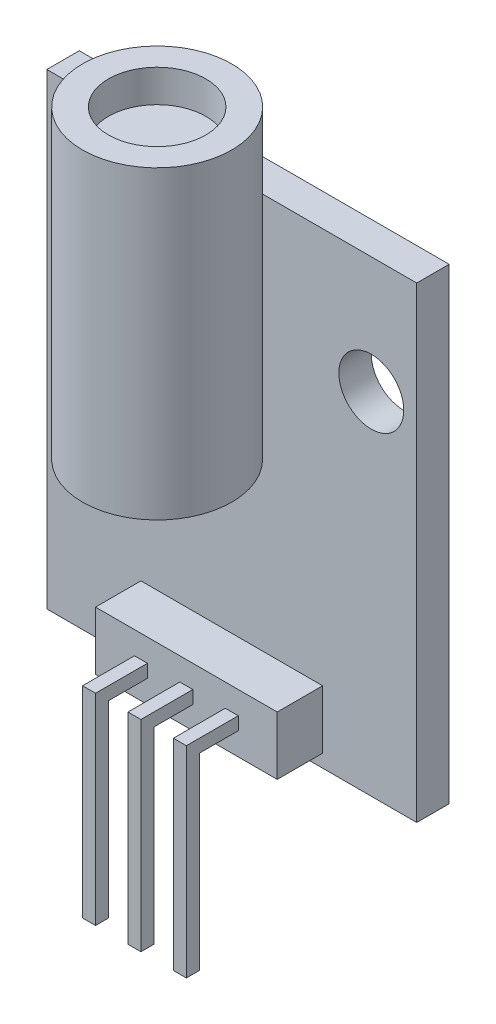
ISO-10303-21;
HEADER;
FILE_DESCRIPTION(('STEP AP214'),'2;1');
FILE_NAME('part.step','',(''),(''),'','','');
FILE_SCHEMA(('AUTOMOTIVE_DESIGN { 1 0 10303 214 1 1 1 1 }'));
ENDSEC;
DATA;
#1=APPLICATION_CONTEXT('core data for automotive mechanical design processes');
#2=APPLICATION_PROTOCOL_DEFINITION('international standard','automotive_design',2000,#1);
#3=PRODUCT_CONTEXT('',#1,'mechanical');
#4=PRODUCT('Part','Part','',(#3));
#5=PRODUCT_RELATED_PRODUCT_CATEGORY('part','',(#4));
#6=PRODUCT_DEFINITION_FORMATION('','',#4);
#7=PRODUCT_DEFINITION_CONTEXT('part definition',#1,'design');
#8=PRODUCT_DEFINITION('design','',#6,#7);
#9=PRODUCT_DEFINITION_SHAPE('','',#8);
#10=(LENGTH_UNIT() NAMED_UNIT(*) SI_UNIT(.MILLI.,.METRE.));
#11=(NAMED_UNIT(*) PLANE_ANGLE_UNIT() SI_UNIT($,.RADIAN.));
#12=(NAMED_UNIT(*) SI_UNIT($,.STERADIAN.) SOLID_ANGLE_UNIT());
#13=UNCERTAINTY_MEASURE_WITH_UNIT(LENGTH_MEASURE(1.E-05),#10,'distance_accuracy_value','');
#14=(GEOMETRIC_REPRESENTATION_CONTEXT(3) GLOBAL_UNCERTAINTY_ASSIGNED_CONTEXT((#13)) GLOBAL_UNIT_ASSIGNED_CONTEXT((#10,
#11,#12)) REPRESENTATION_CONTEXT('',''));
#15=CARTESIAN_POINT('',(0.,0.,0.));
#16=DIRECTION('',(0.,0.,1.));
#17=DIRECTION('',(1.,0.,0.));
#18=AXIS2_PLACEMENT_3D('',#15,#16,#17);
#19=CARTESIAN_POINT('',(0.,1.016,3.556));
#20=DIRECTION('',(0.,1.,0.));
#21=DIRECTION('',(0.,0.,1.));
#22=AXIS2_PLACEMENT_3D('',#19,#20,#21);
#23=CYLINDRICAL_SURFACE('',#22,2.921);
#24=CARTESIAN_POINT('',(0.,1.016,3.556));
#25=DIRECTION('',(0.,1.,0.));
#26=DIRECTION('',(0.,0.,1.));
#27=AXIS2_PLACEMENT_3D('',#24,#25,#26);
#28=CIRCLE('',#27,2.921);
#29=CARTESIAN_POINT('',(0.,1.016,6.477));
#30=VERTEX_POINT('',#29);
#31=EDGE_CURVE('E11',#30,#30,#28,.T.);
#32=ORIENTED_EDGE('',*,*,#31,.T.);
#33=EDGE_LOOP('',(#32));
#34=FACE_BOUND('',#33,.T.);
#35=CARTESIAN_POINT('',(0.,12.954,3.556));
#36=DIRECTION('',(0.,1.,0.));
#37=DIRECTION('',(0.,0.,1.));
#38=AXIS2_PLACEMENT_3D('',#35,#36,#37);
#39=CIRCLE('',#38,2.921);
#40=CARTESIAN_POINT('',(0.,12.954,6.477));
#41=VERTEX_POINT('',#40);
#42=EDGE_CURVE('E63',#41,#41,#39,.T.);
#43=ORIENTED_EDGE('',*,*,#42,.F.);
#44=EDGE_LOOP('',(#43));
#45=FACE_BOUND('',#44,.T.);
#46=ADVANCED_FACE('F57',(#34,#45),#23,.T.);
#47=CARTESIAN_POINT('',(0.,1.016,3.556));
#48=DIRECTION('',(0.,1.,0.));
#49=DIRECTION('',(0.,0.,1.));
#50=AXIS2_PLACEMENT_3D('',#47,#48,#49);
#51=PLANE('',#50);
#52=ORIENTED_EDGE('',*,*,#31,.F.);
#53=EDGE_LOOP('',(#52));
#54=FACE_BOUND('',#53,.T.);
#55=ADVANCED_FACE('F81',(#54),#51,.F.);
#56=CARTESIAN_POINT('',(0.,12.954,3.556));
#57=DIRECTION('',(0.,1.,0.));
#58=DIRECTION('',(0.,0.,1.));
#59=AXIS2_PLACEMENT_3D('',#56,#57,#58);
#60=PLANE('',#59);
#61=CARTESIAN_POINT('',(0.,12.954,3.556));
#62=DIRECTION('',(0.,1.,0.));
#63=DIRECTION('',(0.,0.,1.));
#64=AXIS2_PLACEMENT_3D('',#61,#62,#63);
#65=CIRCLE('',#64,1.905);
#66=CARTESIAN_POINT('',(0.,12.954,5.461));
#67=VERTEX_POINT('',#66);
#68=EDGE_CURVE('E71',#67,#67,#65,.T.);
#69=ORIENTED_EDGE('',*,*,#68,.F.);
#70=EDGE_LOOP('',(#69));
#71=FACE_BOUND('',#70,.T.);
#72=ORIENTED_EDGE('',*,*,#42,.T.);
#73=EDGE_LOOP('',(#72));
#74=FACE_BOUND('',#73,.T.);
#75=ADVANCED_FACE('F79',(#71,#74),#60,.T.);
#76=CARTESIAN_POINT('',(0.,11.684,3.556));
#77=DIRECTION('',(0.,1.,0.));
#78=DIRECTION('',(0.,0.,1.));
#79=AXIS2_PLACEMENT_3D('',#76,#77,#78);
#80=CYLINDRICAL_SURFACE('',#79,1.905);
#81=CARTESIAN_POINT('',(0.,11.684,3.556));
#82=DIRECTION('',(0.,1.,0.));
#83=DIRECTION('',(0.,0.,1.));
#84=AXIS2_PLACEMENT_3D('',#81,#82,#83);
#85=CIRCLE('',#84,1.905);
#86=CARTESIAN_POINT('',(0.,11.684,5.461));
#87=VERTEX_POINT('',#86);
#88=EDGE_CURVE('E67',#87,#87,#85,.T.);
#89=ORIENTED_EDGE('',*,*,#88,.F.);
#90=EDGE_LOOP('',(#89));
#91=FACE_BOUND('',#90,.T.);
#92=ORIENTED_EDGE('',*,*,#68,.T.);
#93=EDGE_LOOP('',(#92));
#94=FACE_BOUND('',#93,.T.);
#95=ADVANCED_FACE('F77',(#91,#94),#80,.F.);
#96=CARTESIAN_POINT('',(0.,11.684,3.556));
#97=DIRECTION('',(0.,1.,0.));
#98=DIRECTION('',(0.,0.,1.));
#99=AXIS2_PLACEMENT_3D('',#96,#97,#98);
#100=PLANE('',#99);
#101=ORIENTED_EDGE('',*,*,#88,.T.);
#102=EDGE_LOOP('',(#101));
#103=FACE_BOUND('',#102,.T.);
#104=ADVANCED_FACE('F88',(#103),#100,.T.);
#105=CLOSED_SHELL('',(#46,#55,#75,#95,#104));
#106=MANIFOLD_SOLID_BREP('B2',#105);
#107=CARTESIAN_POINT('',(1.524,-7.747,4.445));
#108=DIRECTION('',(0.,1.,0.));
#109=DIRECTION('',(0.,0.,1.));
#110=AXIS2_PLACEMENT_3D('',#107,#108,#109);
#111=PLANE('',#110);
#112=DIRECTION('',(1.,0.,0.));
#113=VECTOR('',#112,1.);
#114=CARTESIAN_POINT('',(1.524,-7.747,3.937));
#115=LINE('',#114,#113);
#116=CARTESIAN_POINT('',(1.524,-7.747,3.937));
#117=VERTEX_POINT('',#116);
#118=CARTESIAN_POINT('',(2.032,-7.747,3.937));
#119=VERTEX_POINT('',#118);
#120=EDGE_CURVE('E361',#117,#119,#115,.T.);
#121=ORIENTED_EDGE('',*,*,#120,.F.);
#122=DIRECTION('',(0.,0.,-1.));
#123=VECTOR('',#122,1.);
#124=CARTESIAN_POINT('',(1.524,-7.747,4.445));
#125=LINE('',#124,#123);
#126=CARTESIAN_POINT('',(1.524,-7.747,2.413));
#127=VERTEX_POINT('',#126);
#128=EDGE_CURVE('E447',#117,#127,#125,.T.);
#129=ORIENTED_EDGE('',*,*,#128,.T.);
#130=DIRECTION('',(1.,0.,0.));
#131=VECTOR('',#130,1.);
#132=CARTESIAN_POINT('',(1.524,-7.747,2.413));
#133=LINE('',#132,#131);
#134=CARTESIAN_POINT('',(2.032,-7.747,2.413));
#135=VERTEX_POINT('',#134);
#136=EDGE_CURVE('E452',#127,#135,#133,.T.);
#137=ORIENTED_EDGE('',*,*,#136,.T.);
#138=DIRECTION('',(0.,0.,-1.));
#139=VECTOR('',#138,1.);
#140=CARTESIAN_POINT('',(2.032,-7.747,4.445));
#141=LINE('',#140,#139);
#142=EDGE_CURVE('E449',#119,#135,#141,.T.);
#143=ORIENTED_EDGE('',*,*,#142,.F.);
#144=EDGE_LOOP('',(#121,#129,#137,#143));
#145=FACE_BOUND('',#144,.T.);
#146=ADVANCED_FACE('F152',(#145),#111,.F.);
#147=CARTESIAN_POINT('',(-0.254,-7.747,4.445));
#148=DIRECTION('',(0.,1.,0.));
#149=DIRECTION('',(0.,0.,1.));
#150=AXIS2_PLACEMENT_3D('',#147,#148,#149);
#151=PLANE('',#150);
#152=DIRECTION('',(1.,0.,0.));
#153=VECTOR('',#152,1.);
#154=CARTESIAN_POINT('',(-0.253999999999999,-7.747,3.937));
#155=LINE('',#154,#153);
#156=CARTESIAN_POINT('',(-0.253999999999999,-7.747,3.937));
#157=VERTEX_POINT('',#156);
#158=CARTESIAN_POINT('',(0.254000000000001,-7.747,3.937));
#159=VERTEX_POINT('',#158);
#160=EDGE_CURVE('E365',#157,#159,#155,.T.);
#161=ORIENTED_EDGE('',*,*,#160,.F.);
#162=DIRECTION('',(0.,0.,-1.));
#163=VECTOR('',#162,1.);
#164=CARTESIAN_POINT('',(-0.254,-7.747,4.445));
#165=LINE('',#164,#163);
#166=CARTESIAN_POINT('',(-0.254,-7.747,2.413));
#167=VERTEX_POINT('',#166);
#168=EDGE_CURVE('E175',#157,#167,#165,.T.);
#169=ORIENTED_EDGE('',*,*,#168,.T.);
#170=DIRECTION('',(1.,0.,0.));
#171=VECTOR('',#170,1.);
#172=CARTESIAN_POINT('',(-0.254,-7.747,2.413));
#173=LINE('',#172,#171);
#174=CARTESIAN_POINT('',(0.254,-7.747,2.413));
#175=VERTEX_POINT('',#174);
#176=EDGE_CURVE('E431',#167,#175,#173,.T.);
#177=ORIENTED_EDGE('',*,*,#176,.T.);
#178=DIRECTION('',(0.,0.,-1.));
#179=VECTOR('',#178,1.);
#180=CARTESIAN_POINT('',(0.254,-7.747,4.445));
#181=LINE('',#180,#179);
#182=EDGE_CURVE('E428',#159,#175,#181,.T.);
#183=ORIENTED_EDGE('',*,*,#182,.F.);
#184=EDGE_LOOP('',(#161,#169,#177,#183));
#185=FACE_BOUND('',#184,.T.);
#186=ADVANCED_FACE('F549',(#185),#151,.F.);
#187=CARTESIAN_POINT('',(-2.032,-7.747,4.445));
#188=DIRECTION('',(0.,1.,0.));
#189=DIRECTION('',(0.,0.,1.));
#190=AXIS2_PLACEMENT_3D('',#187,#188,#189);
#191=PLANE('',#190);
#192=DIRECTION('',(1.,0.,0.));
#193=VECTOR('',#192,1.);
#194=CARTESIAN_POINT('',(-2.032,-7.747,3.937));
#195=LINE('',#194,#193);
#196=CARTESIAN_POINT('',(-2.032,-7.747,3.937));
#197=VERTEX_POINT('',#196);
#198=CARTESIAN_POINT('',(-1.524,-7.747,3.937));
#199=VERTEX_POINT('',#198);
#200=EDGE_CURVE('E348',#197,#199,#195,.T.);
#201=ORIENTED_EDGE('',*,*,#200,.F.);
#202=DIRECTION('',(0.,0.,-1.));
#203=VECTOR('',#202,1.);
#204=CARTESIAN_POINT('',(-2.032,-7.747,4.445));
#205=LINE('',#204,#203);
#206=CARTESIAN_POINT('',(-2.032,-7.747,2.413));
#207=VERTEX_POINT('',#206);
#208=EDGE_CURVE('E167',#197,#207,#205,.T.);
#209=ORIENTED_EDGE('',*,*,#208,.T.);
#210=DIRECTION('',(1.,0.,0.));
#211=VECTOR('',#210,1.);
#212=CARTESIAN_POINT('',(-2.032,-7.747,2.413));
#213=LINE('',#212,#211);
#214=CARTESIAN_POINT('',(-1.524,-7.747,2.413));
#215=VERTEX_POINT('',#214);
#216=EDGE_CURVE('E399',#207,#215,#213,.T.);
#217=ORIENTED_EDGE('',*,*,#216,.T.);
#218=DIRECTION('',(0.,0.,-1.));
#219=VECTOR('',#218,1.);
#220=CARTESIAN_POINT('',(-1.524,-7.747,4.445));
#221=LINE('',#220,#219);
#222=EDGE_CURVE('E403',#199,#215,#221,.T.);
#223=ORIENTED_EDGE('',*,*,#222,.F.);
#224=EDGE_LOOP('',(#201,#209,#217,#223));
#225=FACE_BOUND('',#224,.T.);
#226=ADVANCED_FACE('F556',(#225),#191,.F.);
#227=CARTESIAN_POINT('',(0.,0.,2.413));
#228=DIRECTION('',(0.,0.,1.));
#229=DIRECTION('',(1.,0.,0.));
#230=AXIS2_PLACEMENT_3D('',#227,#228,#229);
#231=PLANE('',#230);
#232=DIRECTION('',(0.,1.,0.));
#233=VECTOR('',#232,1.);
#234=CARTESIAN_POINT('',(3.556,-6.35,2.413));
#235=LINE('',#234,#233);
#236=CARTESIAN_POINT('',(3.556,-8.636,2.413));
#237=VERTEX_POINT('',#236);
#238=CARTESIAN_POINT('',(3.556,-6.35,2.413));
#239=VERTEX_POINT('',#238);
#240=EDGE_CURVE('E468',#237,#239,#235,.T.);
#241=ORIENTED_EDGE('',*,*,#240,.T.);
#242=DIRECTION('',(-1.,0.,0.));
#243=VECTOR('',#242,1.);
#244=CARTESIAN_POINT('',(-3.556,-6.35,2.413));
#245=LINE('',#244,#243);
#246=CARTESIAN_POINT('',(-3.556,-6.35,2.413));
#247=VERTEX_POINT('',#246);
#248=EDGE_CURVE('E471',#239,#247,#245,.T.);
#249=ORIENTED_EDGE('',*,*,#248,.T.);
#250=DIRECTION('',(0.,-1.,0.));
#251=VECTOR('',#250,1.);
#252=CARTESIAN_POINT('',(-3.556,-6.35,2.413));
#253=LINE('',#252,#251);
#254=CARTESIAN_POINT('',(-3.556,-8.636,2.413));
#255=VERTEX_POINT('',#254);
#256=EDGE_CURVE('E474',#247,#255,#253,.T.);
#257=ORIENTED_EDGE('',*,*,#256,.T.);
#258=DIRECTION('',(1.,0.,0.));
#259=VECTOR('',#258,1.);
#260=CARTESIAN_POINT('',(-3.556,-8.636,2.413));
#261=LINE('',#260,#259);
#262=EDGE_CURVE('E476',#255,#237,#261,.T.);
#263=ORIENTED_EDGE('',*,*,#262,.T.);
#264=EDGE_LOOP('',(#241,#249,#257,#263));
#265=FACE_BOUND('',#264,.T.);
#266=DIRECTION('',(-1.,0.,0.));
#267=VECTOR('',#266,1.);
#268=CARTESIAN_POINT('',(1.524,-7.239,2.413));
#269=LINE('',#268,#267);
#270=CARTESIAN_POINT('',(2.032,-7.239,2.413));
#271=VERTEX_POINT('',#270);
#272=CARTESIAN_POINT('',(1.524,-7.239,2.413));
#273=VERTEX_POINT('',#272);
#274=EDGE_CURVE('E459',#271,#273,#269,.T.);
#275=ORIENTED_EDGE('',*,*,#274,.F.);
#276=DIRECTION('',(0.,1.,0.));
#277=VECTOR('',#276,1.);
#278=CARTESIAN_POINT('',(2.032,-7.239,2.413));
#279=LINE('',#278,#277);
#280=EDGE_CURVE('E424',#135,#271,#279,.T.);
#281=ORIENTED_EDGE('',*,*,#280,.F.);
#282=ORIENTED_EDGE('',*,*,#136,.F.);
#283=DIRECTION('',(0.,-1.,0.));
#284=VECTOR('',#283,1.);
#285=CARTESIAN_POINT('',(1.524,-7.239,2.413));
#286=LINE('',#285,#284);
#287=EDGE_CURVE('E455',#273,#127,#286,.T.);
#288=ORIENTED_EDGE('',*,*,#287,.F.);
#289=EDGE_LOOP('',(#275,#281,#282,#288));
#290=FACE_BOUND('',#289,.T.);
#291=DIRECTION('',(-1.,0.,0.));
#292=VECTOR('',#291,1.);
#293=CARTESIAN_POINT('',(-0.254,-7.239,2.413));
#294=LINE('',#293,#292);
#295=CARTESIAN_POINT('',(0.254,-7.239,2.413));
#296=VERTEX_POINT('',#295);
#297=CARTESIAN_POINT('',(-0.254,-7.239,2.413));
#298=VERTEX_POINT('',#297);
#299=EDGE_CURVE('E436',#296,#298,#294,.T.);
#300=ORIENTED_EDGE('',*,*,#299,.F.);
#301=DIRECTION('',(0.,1.,0.));
#302=VECTOR('',#301,1.);
#303=CARTESIAN_POINT('',(0.254,-7.239,2.413));
#304=LINE('',#303,#302);
#305=EDGE_CURVE('E408',#175,#296,#304,.T.);
#306=ORIENTED_EDGE('',*,*,#305,.F.);
#307=ORIENTED_EDGE('',*,*,#176,.F.);
#308=DIRECTION('',(0.,-1.,0.));
#309=VECTOR('',#308,1.);
#310=CARTESIAN_POINT('',(-0.254,-7.239,2.413));
#311=LINE('',#310,#309);
#312=EDGE_CURVE('E433',#298,#167,#311,.T.);
#313=ORIENTED_EDGE('',*,*,#312,.F.);
#314=EDGE_LOOP('',(#300,#306,#307,#313));
#315=FACE_BOUND('',#314,.T.);
#316=DIRECTION('',(-1.,0.,0.));
#317=VECTOR('',#316,1.);
#318=CARTESIAN_POINT('',(-2.032,-7.239,2.413));
#319=LINE('',#318,#317);
#320=CARTESIAN_POINT('',(-1.524,-7.239,2.413));
#321=VERTEX_POINT('',#320);
#322=CARTESIAN_POINT('',(-2.032,-7.239,2.413));
#323=VERTEX_POINT('',#322);
#324=EDGE_CURVE('E407',#321,#323,#319,.T.);
#325=ORIENTED_EDGE('',*,*,#324,.F.);
#326=DIRECTION('',(0.,1.,0.));
#327=VECTOR('',#326,1.);
#328=CARTESIAN_POINT('',(-1.524,-7.239,2.413));
#329=LINE('',#328,#327);
#330=EDGE_CURVE('E404',#215,#321,#329,.T.);
#331=ORIENTED_EDGE('',*,*,#330,.F.);
#332=ORIENTED_EDGE('',*,*,#216,.F.);
#333=DIRECTION('',(0.,-1.,0.));
#334=VECTOR('',#333,1.);
#335=CARTESIAN_POINT('',(-2.032,-7.239,2.413));
#336=LINE('',#335,#334);
#337=EDGE_CURVE('E410',#323,#207,#336,.T.);
#338=ORIENTED_EDGE('',*,*,#337,.F.);
#339=EDGE_LOOP('',(#325,#331,#332,#338));
#340=FACE_BOUND('',#339,.T.);
#341=ADVANCED_FACE('F568',(#265,#290,#315,#340),#231,.T.);
#342=CARTESIAN_POINT('',(0.,0.,0.635));
#343=DIRECTION('',(0.,0.,1.));
#344=DIRECTION('',(1.,0.,0.));
#345=AXIS2_PLACEMENT_3D('',#342,#343,#344);
#346=PLANE('',#345);
#347=CARTESIAN_POINT('',(-5.461,4.572,0.635));
#348=DIRECTION('',(0.,0.,1.));
#349=DIRECTION('',(1.,0.,0.));
#350=AXIS2_PLACEMENT_3D('',#347,#348,#349);
#351=CIRCLE('',#350,1.27);
#352=CARTESIAN_POINT('',(-4.191,4.572,0.635));
#353=VERTEX_POINT('',#352);
#354=EDGE_CURVE('E380',#353,#353,#351,.T.);
#355=ORIENTED_EDGE('',*,*,#354,.F.);
#356=EDGE_LOOP('',(#355));
#357=FACE_BOUND('',#356,.T.);
#358=CARTESIAN_POINT('',(5.461,4.572,0.635));
#359=DIRECTION('',(0.,0.,1.));
#360=DIRECTION('',(1.,0.,0.));
#361=AXIS2_PLACEMENT_3D('',#358,#359,#360);
#362=CIRCLE('',#361,1.27);
#363=CARTESIAN_POINT('',(6.731,4.572,0.635));
#364=VERTEX_POINT('',#363);
#365=EDGE_CURVE('E964',#364,#364,#362,.T.);
#366=ORIENTED_EDGE('',*,*,#365,.F.);
#367=EDGE_LOOP('',(#366));
#368=FACE_BOUND('',#367,.T.);
#369=DIRECTION('',(0.,1.,0.));
#370=VECTOR('',#369,1.);
#371=CARTESIAN_POINT('',(7.239,9.144,0.635));
#372=LINE('',#371,#370);
#373=CARTESIAN_POINT('',(7.239,-9.144,0.635));
#374=VERTEX_POINT('',#373);
#375=CARTESIAN_POINT('',(7.239,9.144,0.635));
#376=VERTEX_POINT('',#375);
#377=EDGE_CURVE('E497',#374,#376,#372,.T.);
#378=ORIENTED_EDGE('',*,*,#377,.T.);
#379=DIRECTION('',(-1.,0.,0.));
#380=VECTOR('',#379,1.);
#381=CARTESIAN_POINT('',(-7.239,9.144,0.635));
#382=LINE('',#381,#380);
#383=CARTESIAN_POINT('',(-7.239,9.144,0.635));
#384=VERTEX_POINT('',#383);
#385=EDGE_CURVE('E500',#376,#384,#382,.T.);
#386=ORIENTED_EDGE('',*,*,#385,.T.);
#387=DIRECTION('',(0.,-1.,0.));
#388=VECTOR('',#387,1.);
#389=CARTESIAN_POINT('',(-7.239,9.144,0.635));
#390=LINE('',#389,#388);
#391=CARTESIAN_POINT('',(-7.239,-9.144,0.635));
#392=VERTEX_POINT('',#391);
#393=EDGE_CURVE('E503',#384,#392,#390,.T.);
#394=ORIENTED_EDGE('',*,*,#393,.T.);
#395=DIRECTION('',(1.,0.,0.));
#396=VECTOR('',#395,1.);
#397=CARTESIAN_POINT('',(-7.239,-9.144,0.635));
#398=LINE('',#397,#396);
#399=EDGE_CURVE('E505',#392,#374,#398,.T.);
#400=ORIENTED_EDGE('',*,*,#399,.T.);
#401=EDGE_LOOP('',(#378,#386,#394,#400));
#402=FACE_BOUND('',#401,.T.);
#403=DIRECTION('',(-1.,0.,0.));
#404=VECTOR('',#403,1.);
#405=CARTESIAN_POINT('',(-3.556,-6.35,0.635));
#406=LINE('',#405,#404);
#407=CARTESIAN_POINT('',(3.556,-6.35,0.635));
#408=VERTEX_POINT('',#407);
#409=CARTESIAN_POINT('',(-3.556,-6.35,0.635));
#410=VERTEX_POINT('',#409);
#411=EDGE_CURVE('E481',#408,#410,#406,.T.);
#412=ORIENTED_EDGE('',*,*,#411,.F.);
#413=DIRECTION('',(0.,1.,0.));
#414=VECTOR('',#413,1.);
#415=CARTESIAN_POINT('',(3.556,-6.35,0.635));
#416=LINE('',#415,#414);
#417=CARTESIAN_POINT('',(3.556,-8.636,0.635));
#418=VERTEX_POINT('',#417);
#419=EDGE_CURVE('E420',#418,#408,#416,.T.);
#420=ORIENTED_EDGE('',*,*,#419,.F.);
#421=DIRECTION('',(1.,0.,0.));
#422=VECTOR('',#421,1.);
#423=CARTESIAN_POINT('',(-3.556,-8.636,0.635));
#424=LINE('',#423,#422);
#425=CARTESIAN_POINT('',(-3.556,-8.636,0.635));
#426=VERTEX_POINT('',#425);
#427=EDGE_CURVE('E472',#426,#418,#424,.T.);
#428=ORIENTED_EDGE('',*,*,#427,.F.);
#429=DIRECTION('',(0.,-1.,0.));
#430=VECTOR('',#429,1.);
#431=CARTESIAN_POINT('',(-3.556,-6.35,0.635));
#432=LINE('',#431,#430);
#433=EDGE_CURVE('E483',#410,#426,#432,.T.);
#434=ORIENTED_EDGE('',*,*,#433,.F.);
#435=EDGE_LOOP('',(#412,#420,#428,#434));
#436=FACE_BOUND('',#435,.T.);
#437=ADVANCED_FACE('F539',(#357,#368,#402,#436),#346,.T.);
#438=CARTESIAN_POINT('',(7.239,9.144,0.635));
#439=DIRECTION('',(-1.,0.,0.));
#440=DIRECTION('',(0.,-1.,0.));
#441=AXIS2_PLACEMENT_3D('',#438,#439,#440);
#442=PLANE('',#441);
#443=DIRECTION('',(0.,1.,0.));
#444=VECTOR('',#443,1.);
#445=CARTESIAN_POINT('',(7.239,9.144,-0.635));
#446=LINE('',#445,#444);
#447=CARTESIAN_POINT('',(7.239,-9.144,-0.635));
#448=VERTEX_POINT('',#447);
#449=CARTESIAN_POINT('',(7.239,9.144,-0.635));
#450=VERTEX_POINT('',#449);
#451=EDGE_CURVE('E496',#448,#450,#446,.T.);
#452=ORIENTED_EDGE('',*,*,#451,.T.);
#453=DIRECTION('',(0.,0.,-1.));
#454=VECTOR('',#453,1.);
#455=CARTESIAN_POINT('',(7.239,9.144,0.635));
#456=LINE('',#455,#454);
#457=EDGE_CURVE('E55',#376,#450,#456,.T.);
#458=ORIENTED_EDGE('',*,*,#457,.F.);
#459=ORIENTED_EDGE('',*,*,#377,.F.);
#460=DIRECTION('',(0.,0.,-1.));
#461=VECTOR('',#460,1.);
#462=CARTESIAN_POINT('',(7.239,-9.144,0.635));
#463=LINE('',#462,#461);
#464=EDGE_CURVE('E507',#374,#448,#463,.T.);
#465=ORIENTED_EDGE('',*,*,#464,.T.);
#466=EDGE_LOOP('',(#452,#458,#459,#465));
#467=FACE_BOUND('',#466,.T.);
#468=ADVANCED_FACE('F154',(#467),#442,.F.);
#469=CARTESIAN_POINT('',(-7.239,9.144,0.635));
#470=DIRECTION('',(0.,-1.,0.));
#471=DIRECTION('',(0.,0.,-1.));
#472=AXIS2_PLACEMENT_3D('',#469,#470,#471);
#473=PLANE('',#472);
#474=DIRECTION('',(-1.,0.,0.));
#475=VECTOR('',#474,1.);
#476=CARTESIAN_POINT('',(-7.239,9.144,-0.635));
#477=LINE('',#476,#475);
#478=CARTESIAN_POINT('',(-7.239,9.144,-0.635));
#479=VERTEX_POINT('',#478);
#480=EDGE_CURVE('E510',#450,#479,#477,.T.);
#481=ORIENTED_EDGE('',*,*,#480,.T.);
#482=DIRECTION('',(0.,0.,-1.));
#483=VECTOR('',#482,1.);
#484=CARTESIAN_POINT('',(-7.239,9.144,0.635));
#485=LINE('',#484,#483);
#486=EDGE_CURVE('E160',#384,#479,#485,.T.);
#487=ORIENTED_EDGE('',*,*,#486,.F.);
#488=ORIENTED_EDGE('',*,*,#385,.F.);
#489=ORIENTED_EDGE('',*,*,#457,.T.);
#490=EDGE_LOOP('',(#481,#487,#488,#489));
#491=FACE_BOUND('',#490,.T.);
#492=ADVANCED_FACE('F541',(#491),#473,.F.);
#493=CARTESIAN_POINT('',(-7.239,9.144,0.635));
#494=DIRECTION('',(1.,0.,0.));
#495=DIRECTION('',(0.,1.,0.));
#496=AXIS2_PLACEMENT_3D('',#493,#494,#495);
#497=PLANE('',#496);
#498=DIRECTION('',(0.,-1.,0.));
#499=VECTOR('',#498,1.);
#500=CARTESIAN_POINT('',(-7.239,9.144,-0.635));
#501=LINE('',#500,#499);
#502=CARTESIAN_POINT('',(-7.239,-9.144,-0.635));
#503=VERTEX_POINT('',#502);
#504=EDGE_CURVE('E512',#479,#503,#501,.T.);
#505=ORIENTED_EDGE('',*,*,#504,.T.);
#506=DIRECTION('',(0.,0.,-1.));
#507=VECTOR('',#506,1.);
#508=CARTESIAN_POINT('',(-7.239,-9.144,0.635));
#509=LINE('',#508,#507);
#510=EDGE_CURVE('E517',#392,#503,#509,.T.);
#511=ORIENTED_EDGE('',*,*,#510,.F.);
#512=ORIENTED_EDGE('',*,*,#393,.F.);
#513=ORIENTED_EDGE('',*,*,#486,.T.);
#514=EDGE_LOOP('',(#505,#511,#512,#513));
#515=FACE_BOUND('',#514,.T.);
#516=ADVANCED_FACE('F524',(#515),#497,.F.);
#517=CARTESIAN_POINT('',(-7.239,-9.144,0.635));
#518=DIRECTION('',(0.,1.,0.));
#519=DIRECTION('',(0.,0.,1.));
#520=AXIS2_PLACEMENT_3D('',#517,#518,#519);
#521=PLANE('',#520);
#522=DIRECTION('',(1.,0.,0.));
#523=VECTOR('',#522,1.);
#524=CARTESIAN_POINT('',(-7.239,-9.144,-0.635));
#525=LINE('',#524,#523);
#526=EDGE_CURVE('E501',#503,#448,#525,.T.);
#527=ORIENTED_EDGE('',*,*,#526,.T.);
#528=ORIENTED_EDGE('',*,*,#464,.F.);
#529=ORIENTED_EDGE('',*,*,#399,.F.);
#530=ORIENTED_EDGE('',*,*,#510,.T.);
#531=EDGE_LOOP('',(#527,#528,#529,#530));
#532=FACE_BOUND('',#531,.T.);
#533=ADVANCED_FACE('F533',(#532),#521,.F.);
#534=CARTESIAN_POINT('',(0.,0.,-0.635));
#535=DIRECTION('',(0.,0.,1.));
#536=DIRECTION('',(1.,0.,0.));
#537=AXIS2_PLACEMENT_3D('',#534,#535,#536);
#538=PLANE('',#537);
#539=CARTESIAN_POINT('',(-5.461,4.572,-0.635));
#540=DIRECTION('',(0.,0.,1.));
#541=DIRECTION('',(1.,0.,0.));
#542=AXIS2_PLACEMENT_3D('',#539,#540,#541);
#543=CIRCLE('',#542,1.27);
#544=CARTESIAN_POINT('',(-4.191,4.572,-0.635));
#545=VERTEX_POINT('',#544);
#546=EDGE_CURVE('E967',#545,#545,#543,.T.);
#547=ORIENTED_EDGE('',*,*,#546,.T.);
#548=EDGE_LOOP('',(#547));
#549=FACE_BOUND('',#548,.T.);
#550=CARTESIAN_POINT('',(5.461,4.572,-0.635));
#551=DIRECTION('',(0.,0.,1.));
#552=DIRECTION('',(1.,0.,0.));
#553=AXIS2_PLACEMENT_3D('',#550,#551,#552);
#554=CIRCLE('',#553,1.27);
#555=CARTESIAN_POINT('',(6.731,4.572,-0.635));
#556=VERTEX_POINT('',#555);
#557=EDGE_CURVE('E968',#556,#556,#554,.T.);
#558=ORIENTED_EDGE('',*,*,#557,.T.);
#559=EDGE_LOOP('',(#558));
#560=FACE_BOUND('',#559,.T.);
#561=ORIENTED_EDGE('',*,*,#451,.F.);
#562=ORIENTED_EDGE('',*,*,#526,.F.);
#563=ORIENTED_EDGE('',*,*,#504,.F.);
#564=ORIENTED_EDGE('',*,*,#480,.F.);
#565=EDGE_LOOP('',(#561,#562,#563,#564));
#566=FACE_BOUND('',#565,.T.);
#567=ADVANCED_FACE('F530',(#549,#560,#566),#538,.F.);
#568=CARTESIAN_POINT('',(3.556,-6.35,2.413));
#569=DIRECTION('',(-1.,0.,0.));
#570=DIRECTION('',(0.,-1.,0.));
#571=AXIS2_PLACEMENT_3D('',#568,#569,#570);
#572=PLANE('',#571);
#573=ORIENTED_EDGE('',*,*,#419,.T.);
#574=DIRECTION('',(0.,0.,-1.));
#575=VECTOR('',#574,1.);
#576=CARTESIAN_POINT('',(3.556,-6.35,2.413));
#577=LINE('',#576,#575);
#578=EDGE_CURVE('E494',#239,#408,#577,.T.);
#579=ORIENTED_EDGE('',*,*,#578,.F.);
#580=ORIENTED_EDGE('',*,*,#240,.F.);
#581=DIRECTION('',(0.,0.,-1.));
#582=VECTOR('',#581,1.);
#583=CARTESIAN_POINT('',(3.556,-8.636,2.413));
#584=LINE('',#583,#582);
#585=EDGE_CURVE('E478',#237,#418,#584,.T.);
#586=ORIENTED_EDGE('',*,*,#585,.T.);
#587=EDGE_LOOP('',(#573,#579,#580,#586));
#588=FACE_BOUND('',#587,.T.);
#589=ADVANCED_FACE('F584',(#588),#572,.F.);
#590=CARTESIAN_POINT('',(-3.556,-6.35,2.413));
#591=DIRECTION('',(0.,-1.,0.));
#592=DIRECTION('',(0.,0.,-1.));
#593=AXIS2_PLACEMENT_3D('',#590,#591,#592);
#594=PLANE('',#593);
#595=ORIENTED_EDGE('',*,*,#411,.T.);
#596=DIRECTION('',(0.,0.,-1.));
#597=VECTOR('',#596,1.);
#598=CARTESIAN_POINT('',(-3.556,-6.35,2.413));
#599=LINE('',#598,#597);
#600=EDGE_CURVE('E491',#247,#410,#599,.T.);
#601=ORIENTED_EDGE('',*,*,#600,.F.);
#602=ORIENTED_EDGE('',*,*,#248,.F.);
#603=ORIENTED_EDGE('',*,*,#578,.T.);
#604=EDGE_LOOP('',(#595,#601,#602,#603));
#605=FACE_BOUND('',#604,.T.);
#606=ADVANCED_FACE('F580',(#605),#594,.F.);
#607=CARTESIAN_POINT('',(-3.556,-6.35,2.413));
#608=DIRECTION('',(1.,0.,0.));
#609=DIRECTION('',(0.,1.,0.));
#610=AXIS2_PLACEMENT_3D('',#607,#608,#609);
#611=PLANE('',#610);
#612=ORIENTED_EDGE('',*,*,#433,.T.);
#613=DIRECTION('',(0.,0.,-1.));
#614=VECTOR('',#613,1.);
#615=CARTESIAN_POINT('',(-3.556,-8.636,2.413));
#616=LINE('',#615,#614);
#617=EDGE_CURVE('E489',#255,#426,#616,.T.);
#618=ORIENTED_EDGE('',*,*,#617,.F.);
#619=ORIENTED_EDGE('',*,*,#256,.F.);
#620=ORIENTED_EDGE('',*,*,#600,.T.);
#621=EDGE_LOOP('',(#612,#618,#619,#620));
#622=FACE_BOUND('',#621,.T.);
#623=ADVANCED_FACE('F576',(#622),#611,.F.);
#624=CARTESIAN_POINT('',(-3.556,-8.636,2.413));
#625=DIRECTION('',(0.,1.,0.));
#626=DIRECTION('',(0.,0.,1.));
#627=AXIS2_PLACEMENT_3D('',#624,#625,#626);
#628=PLANE('',#627);
#629=ORIENTED_EDGE('',*,*,#427,.T.);
#630=ORIENTED_EDGE('',*,*,#585,.F.);
#631=ORIENTED_EDGE('',*,*,#262,.F.);
#632=ORIENTED_EDGE('',*,*,#617,.T.);
#633=EDGE_LOOP('',(#629,#630,#631,#632));
#634=FACE_BOUND('',#633,.T.);
#635=ADVANCED_FACE('F572',(#634),#628,.F.);
#636=CARTESIAN_POINT('',(2.032,-7.239,4.445));
#637=DIRECTION('',(-1.,0.,0.));
#638=DIRECTION('',(0.,0.,1.));
#639=AXIS2_PLACEMENT_3D('',#636,#637,#638);
#640=PLANE('',#639);
#641=ORIENTED_EDGE('',*,*,#280,.T.);
#642=DIRECTION('',(0.,0.,-1.));
#643=VECTOR('',#642,1.);
#644=CARTESIAN_POINT('',(2.032,-7.239,4.445));
#645=LINE('',#644,#643);
#646=CARTESIAN_POINT('',(2.032,-7.239,4.445));
#647=VERTEX_POINT('',#646);
#648=EDGE_CURVE('E351',#647,#271,#645,.T.);
#649=ORIENTED_EDGE('',*,*,#648,.F.);
#650=DIRECTION('',(0.,1.,0.));
#651=VECTOR('',#650,1.);
#652=CARTESIAN_POINT('',(2.032,-7.239,4.445));
#653=LINE('',#652,#651);
#654=CARTESIAN_POINT('',(2.032,-15.113,4.445));
#655=VERTEX_POINT('',#654);
#656=EDGE_CURVE('E456',#655,#647,#653,.T.);
#657=ORIENTED_EDGE('',*,*,#656,.F.);
#658=DIRECTION('',(0.,0.,1.));
#659=VECTOR('',#658,1.);
#660=CARTESIAN_POINT('',(2.032,-15.113,4.445));
#661=LINE('',#660,#659);
#662=CARTESIAN_POINT('',(2.032,-15.113,3.937));
#663=VERTEX_POINT('',#662);
#664=EDGE_CURVE('E388',#663,#655,#661,.T.);
#665=ORIENTED_EDGE('',*,*,#664,.F.);
#666=DIRECTION('',(0.,1.,0.));
#667=VECTOR('',#666,1.);
#668=CARTESIAN_POINT('',(2.032,-15.113,3.937));
#669=LINE('',#668,#667);
#670=EDGE_CURVE('E379',#663,#119,#669,.T.);
#671=ORIENTED_EDGE('',*,*,#670,.T.);
#672=ORIENTED_EDGE('',*,*,#142,.T.);
#673=EDGE_LOOP('',(#641,#649,#657,#665,#671,#672));
#674=FACE_BOUND('',#673,.T.);
#675=ADVANCED_FACE('F575',(#674),#640,.F.);
#676=CARTESIAN_POINT('',(1.524,-7.239,4.445));
#677=DIRECTION('',(0.,-1.,0.));
#678=DIRECTION('',(0.,0.,-1.));
#679=AXIS2_PLACEMENT_3D('',#676,#677,#678);
#680=PLANE('',#679);
#681=ORIENTED_EDGE('',*,*,#274,.T.);
#682=DIRECTION('',(0.,0.,-1.));
#683=VECTOR('',#682,1.);
#684=CARTESIAN_POINT('',(1.524,-7.239,4.445));
#685=LINE('',#684,#683);
#686=CARTESIAN_POINT('',(1.524,-7.239,4.445));
#687=VERTEX_POINT('',#686);
#688=EDGE_CURVE('E353',#687,#273,#685,.T.);
#689=ORIENTED_EDGE('',*,*,#688,.F.);
#690=DIRECTION('',(-1.,0.,0.));
#691=VECTOR('',#690,1.);
#692=CARTESIAN_POINT('',(1.524,-7.239,4.445));
#693=LINE('',#692,#691);
#694=EDGE_CURVE('E464',#647,#687,#693,.T.);
#695=ORIENTED_EDGE('',*,*,#694,.F.);
#696=ORIENTED_EDGE('',*,*,#648,.T.);
#697=EDGE_LOOP('',(#681,#689,#695,#696));
#698=FACE_BOUND('',#697,.T.);
#699=ADVANCED_FACE('F818',(#698),#680,.F.);
#700=CARTESIAN_POINT('',(1.524,-7.239,4.445));
#701=DIRECTION('',(1.,0.,0.));
#702=DIRECTION('',(0.,0.,-1.));
#703=AXIS2_PLACEMENT_3D('',#700,#701,#702);
#704=PLANE('',#703);
#705=ORIENTED_EDGE('',*,*,#287,.T.);
#706=ORIENTED_EDGE('',*,*,#128,.F.);
#707=DIRECTION('',(0.,1.,0.));
#708=VECTOR('',#707,1.);
#709=CARTESIAN_POINT('',(1.524,-15.113,3.937));
#710=LINE('',#709,#708);
#711=CARTESIAN_POINT('',(1.524,-15.113,3.937));
#712=VERTEX_POINT('',#711);
#713=EDGE_CURVE('E377',#712,#117,#710,.T.);
#714=ORIENTED_EDGE('',*,*,#713,.F.);
#715=DIRECTION('',(0.,0.,-1.));
#716=VECTOR('',#715,1.);
#717=CARTESIAN_POINT('',(1.524,-15.113,4.445));
#718=LINE('',#717,#716);
#719=CARTESIAN_POINT('',(1.524,-15.113,4.445));
#720=VERTEX_POINT('',#719);
#721=EDGE_CURVE('E385',#720,#712,#718,.T.);
#722=ORIENTED_EDGE('',*,*,#721,.F.);
#723=DIRECTION('',(0.,-1.,0.));
#724=VECTOR('',#723,1.);
#725=CARTESIAN_POINT('',(1.524,-7.239,4.445));
#726=LINE('',#725,#724);
#727=EDGE_CURVE('E451',#687,#720,#726,.T.);
#728=ORIENTED_EDGE('',*,*,#727,.F.);
#729=ORIENTED_EDGE('',*,*,#688,.T.);
#730=EDGE_LOOP('',(#705,#706,#714,#722,#728,#729));
#731=FACE_BOUND('',#730,.T.);
#732=ADVANCED_FACE('F561',(#731),#704,.F.);
#733=CARTESIAN_POINT('',(0.,0.,4.445));
#734=DIRECTION('',(0.,0.,1.));
#735=DIRECTION('',(1.,0.,0.));
#736=AXIS2_PLACEMENT_3D('',#733,#734,#735);
#737=PLANE('',#736);
#738=ORIENTED_EDGE('',*,*,#656,.T.);
#739=ORIENTED_EDGE('',*,*,#694,.T.);
#740=ORIENTED_EDGE('',*,*,#727,.T.);
#741=DIRECTION('',(-1.,0.,0.));
#742=VECTOR('',#741,1.);
#743=CARTESIAN_POINT('',(1.524,-15.113,4.445));
#744=LINE('',#743,#742);
#745=EDGE_CURVE('E383',#655,#720,#744,.T.);
#746=ORIENTED_EDGE('',*,*,#745,.F.);
#747=EDGE_LOOP('',(#738,#739,#740,#746));
#748=FACE_BOUND('',#747,.T.);
#749=ADVANCED_FACE('F563',(#748),#737,.T.);
#750=CARTESIAN_POINT('',(0.254,-7.239,4.445));
#751=DIRECTION('',(-1.,0.,0.));
#752=DIRECTION('',(0.,-1.,0.));
#753=AXIS2_PLACEMENT_3D('',#750,#751,#752);
#754=PLANE('',#753);
#755=ORIENTED_EDGE('',*,*,#305,.T.);
#756=DIRECTION('',(0.,0.,-1.));
#757=VECTOR('',#756,1.);
#758=CARTESIAN_POINT('',(0.254,-7.239,4.445));
#759=LINE('',#758,#757);
#760=CARTESIAN_POINT('',(0.254,-7.239,4.445));
#761=VERTEX_POINT('',#760);
#762=EDGE_CURVE('E421',#761,#296,#759,.T.);
#763=ORIENTED_EDGE('',*,*,#762,.F.);
#764=DIRECTION('',(0.,1.,0.));
#765=VECTOR('',#764,1.);
#766=CARTESIAN_POINT('',(0.254,-7.239,4.445));
#767=LINE('',#766,#765);
#768=CARTESIAN_POINT('',(0.254000000000001,-15.113,4.445));
#769=VERTEX_POINT('',#768);
#770=EDGE_CURVE('E434',#769,#761,#767,.T.);
#771=ORIENTED_EDGE('',*,*,#770,.F.);
#772=DIRECTION('',(0.,0.,1.));
#773=VECTOR('',#772,1.);
#774=CARTESIAN_POINT('',(0.254000000000001,-15.113,3.937));
#775=LINE('',#774,#773);
#776=CARTESIAN_POINT('',(0.254000000000001,-15.113,3.937));
#777=VERTEX_POINT('',#776);
#778=EDGE_CURVE('E370',#777,#769,#775,.T.);
#779=ORIENTED_EDGE('',*,*,#778,.F.);
#780=DIRECTION('',(0.,1.,0.));
#781=VECTOR('',#780,1.);
#782=CARTESIAN_POINT('',(0.254000000000001,-15.113,3.937));
#783=LINE('',#782,#781);
#784=EDGE_CURVE('E360',#777,#159,#783,.T.);
#785=ORIENTED_EDGE('',*,*,#784,.T.);
#786=ORIENTED_EDGE('',*,*,#182,.T.);
#787=EDGE_LOOP('',(#755,#763,#771,#779,#785,#786));
#788=FACE_BOUND('',#787,.T.);
#789=ADVANCED_FACE('F566',(#788),#754,.F.);
#790=CARTESIAN_POINT('',(-0.254,-7.239,4.445));
#791=DIRECTION('',(0.,-1.,0.));
#792=DIRECTION('',(0.,0.,-1.));
#793=AXIS2_PLACEMENT_3D('',#790,#791,#792);
#794=PLANE('',#793);
#795=ORIENTED_EDGE('',*,*,#299,.T.);
#796=DIRECTION('',(0.,0.,-1.));
#797=VECTOR('',#796,1.);
#798=CARTESIAN_POINT('',(-0.254,-7.239,4.445));
#799=LINE('',#798,#797);
#800=CARTESIAN_POINT('',(-0.254,-7.239,4.445));
#801=VERTEX_POINT('',#800);
#802=EDGE_CURVE('E423',#801,#298,#799,.T.);
#803=ORIENTED_EDGE('',*,*,#802,.F.);
#804=DIRECTION('',(-1.,0.,0.));
#805=VECTOR('',#804,1.);
#806=CARTESIAN_POINT('',(-0.254,-7.239,4.445));
#807=LINE('',#806,#805);
#808=EDGE_CURVE('E441',#761,#801,#807,.T.);
#809=ORIENTED_EDGE('',*,*,#808,.F.);
#810=ORIENTED_EDGE('',*,*,#762,.T.);
#811=EDGE_LOOP('',(#795,#803,#809,#810));
#812=FACE_BOUND('',#811,.T.);
#813=ADVANCED_FACE('F786',(#812),#794,.F.);
#814=CARTESIAN_POINT('',(-0.254,-7.239,4.445));
#815=DIRECTION('',(1.,0.,0.));
#816=DIRECTION('',(0.,1.,0.));
#817=AXIS2_PLACEMENT_3D('',#814,#815,#816);
#818=PLANE('',#817);
#819=ORIENTED_EDGE('',*,*,#312,.T.);
#820=ORIENTED_EDGE('',*,*,#168,.F.);
#821=DIRECTION('',(0.,1.,0.));
#822=VECTOR('',#821,1.);
#823=CARTESIAN_POINT('',(-0.253999999999999,-15.113,3.937));
#824=LINE('',#823,#822);
#825=CARTESIAN_POINT('',(-0.253999999999999,-15.113,3.937));
#826=VERTEX_POINT('',#825);
#827=EDGE_CURVE('E358',#826,#157,#824,.T.);
#828=ORIENTED_EDGE('',*,*,#827,.F.);
#829=DIRECTION('',(0.,0.,-1.));
#830=VECTOR('',#829,1.);
#831=CARTESIAN_POINT('',(-0.253999999999999,-15.113,3.937));
#832=LINE('',#831,#830);
#833=CARTESIAN_POINT('',(-0.253999999999999,-15.113,4.445));
#834=VERTEX_POINT('',#833);
#835=EDGE_CURVE('E367',#834,#826,#832,.T.);
#836=ORIENTED_EDGE('',*,*,#835,.F.);
#837=DIRECTION('',(0.,-1.,0.));
#838=VECTOR('',#837,1.);
#839=CARTESIAN_POINT('',(-0.254,-7.239,4.445));
#840=LINE('',#839,#838);
#841=EDGE_CURVE('E430',#801,#834,#840,.T.);
#842=ORIENTED_EDGE('',*,*,#841,.F.);
#843=ORIENTED_EDGE('',*,*,#802,.T.);
#844=EDGE_LOOP('',(#819,#820,#828,#836,#842,#843));
#845=FACE_BOUND('',#844,.T.);
#846=ADVANCED_FACE('F774',(#845),#818,.F.);
#847=CARTESIAN_POINT('',(0.,0.,4.445));
#848=DIRECTION('',(0.,0.,1.));
#849=DIRECTION('',(1.,0.,0.));
#850=AXIS2_PLACEMENT_3D('',#847,#848,#849);
#851=PLANE('',#850);
#852=ORIENTED_EDGE('',*,*,#770,.T.);
#853=ORIENTED_EDGE('',*,*,#808,.T.);
#854=ORIENTED_EDGE('',*,*,#841,.T.);
#855=DIRECTION('',(-1.,0.,0.));
#856=VECTOR('',#855,1.);
#857=CARTESIAN_POINT('',(-0.253999999999999,-15.113,4.445));
#858=LINE('',#857,#856);
#859=EDGE_CURVE('E364',#769,#834,#858,.T.);
#860=ORIENTED_EDGE('',*,*,#859,.F.);
#861=EDGE_LOOP('',(#852,#853,#854,#860));
#862=FACE_BOUND('',#861,.T.);
#863=ADVANCED_FACE('F762',(#862),#851,.T.);
#864=CARTESIAN_POINT('',(-1.524,-7.239,4.445));
#865=DIRECTION('',(-1.,0.,0.));
#866=DIRECTION('',(0.,0.,1.));
#867=AXIS2_PLACEMENT_3D('',#864,#865,#866);
#868=PLANE('',#867);
#869=ORIENTED_EDGE('',*,*,#330,.T.);
#870=DIRECTION('',(0.,0.,-1.));
#871=VECTOR('',#870,1.);
#872=CARTESIAN_POINT('',(-1.524,-7.239,4.445));
#873=LINE('',#872,#871);
#874=CARTESIAN_POINT('',(-1.524,-7.239,4.445));
#875=VERTEX_POINT('',#874);
#876=EDGE_CURVE('E418',#875,#321,#873,.T.);
#877=ORIENTED_EDGE('',*,*,#876,.F.);
#878=DIRECTION('',(0.,1.,0.));
#879=VECTOR('',#878,1.);
#880=CARTESIAN_POINT('',(-1.524,-7.239,4.445));
#881=LINE('',#880,#879);
#882=CARTESIAN_POINT('',(-1.524,-15.113,4.445));
#883=VERTEX_POINT('',#882);
#884=EDGE_CURVE('E395',#883,#875,#881,.T.);
#885=ORIENTED_EDGE('',*,*,#884,.F.);
#886=DIRECTION('',(0.,0.,1.));
#887=VECTOR('',#886,1.);
#888=CARTESIAN_POINT('',(-1.524,-15.113,4.445));
#889=LINE('',#888,#887);
#890=CARTESIAN_POINT('',(-1.524,-15.113,3.937));
#891=VERTEX_POINT('',#890);
#892=EDGE_CURVE('E338',#891,#883,#889,.T.);
#893=ORIENTED_EDGE('',*,*,#892,.F.);
#894=DIRECTION('',(0.,1.,0.));
#895=VECTOR('',#894,1.);
#896=CARTESIAN_POINT('',(-1.524,-15.113,3.937));
#897=LINE('',#896,#895);
#898=EDGE_CURVE('E334',#891,#199,#897,.T.);
#899=ORIENTED_EDGE('',*,*,#898,.T.);
#900=ORIENTED_EDGE('',*,*,#222,.T.);
#901=EDGE_LOOP('',(#869,#877,#885,#893,#899,#900));
#902=FACE_BOUND('',#901,.T.);
#903=ADVANCED_FACE('F757',(#902),#868,.F.);
#904=CARTESIAN_POINT('',(-2.032,-7.239,4.445));
#905=DIRECTION('',(0.,-1.,0.));
#906=DIRECTION('',(0.,0.,-1.));
#907=AXIS2_PLACEMENT_3D('',#904,#905,#906);
#908=PLANE('',#907);
#909=ORIENTED_EDGE('',*,*,#324,.T.);
#910=DIRECTION('',(0.,0.,-1.));
#911=VECTOR('',#910,1.);
#912=CARTESIAN_POINT('',(-2.032,-7.239,4.445));
#913=LINE('',#912,#911);
#914=CARTESIAN_POINT('',(-2.032,-7.239,4.445));
#915=VERTEX_POINT('',#914);
#916=EDGE_CURVE('E415',#915,#323,#913,.T.);
#917=ORIENTED_EDGE('',*,*,#916,.F.);
#918=DIRECTION('',(-1.,0.,0.));
#919=VECTOR('',#918,1.);
#920=CARTESIAN_POINT('',(-2.032,-7.239,4.445));
#921=LINE('',#920,#919);
#922=EDGE_CURVE('E398',#875,#915,#921,.T.);
#923=ORIENTED_EDGE('',*,*,#922,.F.);
#924=ORIENTED_EDGE('',*,*,#876,.T.);
#925=EDGE_LOOP('',(#909,#917,#923,#924));
#926=FACE_BOUND('',#925,.T.);
#927=ADVANCED_FACE('F749',(#926),#908,.F.);
#928=CARTESIAN_POINT('',(-2.032,-7.239,4.445));
#929=DIRECTION('',(1.,0.,0.));
#930=DIRECTION('',(0.,0.,-1.));
#931=AXIS2_PLACEMENT_3D('',#928,#929,#930);
#932=PLANE('',#931);
#933=ORIENTED_EDGE('',*,*,#337,.T.);
#934=ORIENTED_EDGE('',*,*,#208,.F.);
#935=DIRECTION('',(0.,1.,0.));
#936=VECTOR('',#935,1.);
#937=CARTESIAN_POINT('',(-2.032,-15.113,3.937));
#938=LINE('',#937,#936);
#939=CARTESIAN_POINT('',(-2.032,-15.113,3.937));
#940=VERTEX_POINT('',#939);
#941=EDGE_CURVE('E332',#940,#197,#938,.T.);
#942=ORIENTED_EDGE('',*,*,#941,.F.);
#943=DIRECTION('',(0.,0.,-1.));
#944=VECTOR('',#943,1.);
#945=CARTESIAN_POINT('',(-2.032,-15.113,4.445));
#946=LINE('',#945,#944);
#947=CARTESIAN_POINT('',(-2.032,-15.113,4.445));
#948=VERTEX_POINT('',#947);
#949=EDGE_CURVE('E339',#948,#940,#946,.T.);
#950=ORIENTED_EDGE('',*,*,#949,.F.);
#951=DIRECTION('',(0.,-1.,0.));
#952=VECTOR('',#951,1.);
#953=CARTESIAN_POINT('',(-2.032,-7.239,4.445));
#954=LINE('',#953,#952);
#955=EDGE_CURVE('E401',#915,#948,#954,.T.);
#956=ORIENTED_EDGE('',*,*,#955,.F.);
#957=ORIENTED_EDGE('',*,*,#916,.T.);
#958=EDGE_LOOP('',(#933,#934,#942,#950,#956,#957));
#959=FACE_BOUND('',#958,.T.);
#960=ADVANCED_FACE('F350',(#959),#932,.F.);
#961=CARTESIAN_POINT('',(0.,0.,4.445));
#962=DIRECTION('',(0.,0.,1.));
#963=DIRECTION('',(1.,0.,0.));
#964=AXIS2_PLACEMENT_3D('',#961,#962,#963);
#965=PLANE('',#964);
#966=ORIENTED_EDGE('',*,*,#884,.T.);
#967=ORIENTED_EDGE('',*,*,#922,.T.);
#968=ORIENTED_EDGE('',*,*,#955,.T.);
#969=DIRECTION('',(-1.,0.,0.));
#970=VECTOR('',#969,1.);
#971=CARTESIAN_POINT('',(-2.032,-15.113,4.445));
#972=LINE('',#971,#970);
#973=EDGE_CURVE('E345',#883,#948,#972,.T.);
#974=ORIENTED_EDGE('',*,*,#973,.F.);
#975=EDGE_LOOP('',(#966,#967,#968,#974));
#976=FACE_BOUND('',#975,.T.);
#977=ADVANCED_FACE('F728',(#976),#965,.T.);
#978=CARTESIAN_POINT('',(-2.032,-15.113,3.937));
#979=DIRECTION('',(0.,0.,1.));
#980=DIRECTION('',(1.,0.,0.));
#981=AXIS2_PLACEMENT_3D('',#978,#979,#980);
#982=PLANE('',#981);
#983=ORIENTED_EDGE('',*,*,#200,.T.);
#984=ORIENTED_EDGE('',*,*,#898,.F.);
#985=DIRECTION('',(1.,0.,0.));
#986=VECTOR('',#985,1.);
#987=CARTESIAN_POINT('',(-2.032,-15.113,3.937));
#988=LINE('',#987,#986);
#989=EDGE_CURVE('E328',#940,#891,#988,.T.);
#990=ORIENTED_EDGE('',*,*,#989,.F.);
#991=ORIENTED_EDGE('',*,*,#941,.T.);
#992=EDGE_LOOP('',(#983,#984,#990,#991));
#993=FACE_BOUND('',#992,.T.);
#994=ADVANCED_FACE('F330',(#993),#982,.F.);
#995=CARTESIAN_POINT('',(0.,-15.113,0.));
#996=DIRECTION('',(0.,-1.,0.));
#997=DIRECTION('',(0.,0.,-1.));
#998=AXIS2_PLACEMENT_3D('',#995,#996,#997);
#999=PLANE('',#998);
#1000=ORIENTED_EDGE('',*,*,#949,.T.);
#1001=ORIENTED_EDGE('',*,*,#989,.T.);
#1002=ORIENTED_EDGE('',*,*,#892,.T.);
#1003=ORIENTED_EDGE('',*,*,#973,.T.);
#1004=EDGE_LOOP('',(#1000,#1001,#1002,#1003));
#1005=FACE_BOUND('',#1004,.T.);
#1006=ADVANCED_FACE('F343',(#1005),#999,.T.);
#1007=CARTESIAN_POINT('',(-0.253999999999999,-15.113,3.937));
#1008=DIRECTION('',(0.,0.,1.));
#1009=DIRECTION('',(1.,0.,0.));
#1010=AXIS2_PLACEMENT_3D('',#1007,#1008,#1009);
#1011=PLANE('',#1010);
#1012=ORIENTED_EDGE('',*,*,#160,.T.);
#1013=ORIENTED_EDGE('',*,*,#784,.F.);
#1014=DIRECTION('',(1.,0.,0.));
#1015=VECTOR('',#1014,1.);
#1016=CARTESIAN_POINT('',(-0.253999999999999,-15.113,3.937));
#1017=LINE('',#1016,#1015);
#1018=EDGE_CURVE('E373',#826,#777,#1017,.T.);
#1019=ORIENTED_EDGE('',*,*,#1018,.F.);
#1020=ORIENTED_EDGE('',*,*,#827,.T.);
#1021=EDGE_LOOP('',(#1012,#1013,#1019,#1020));
#1022=FACE_BOUND('',#1021,.T.);
#1023=ADVANCED_FACE('F701',(#1022),#1011,.F.);
#1024=CARTESIAN_POINT('',(0.,-15.113,0.));
#1025=DIRECTION('',(0.,1.,0.));
#1026=DIRECTION('',(0.,0.,1.));
#1027=AXIS2_PLACEMENT_3D('',#1024,#1025,#1026);
#1028=PLANE('',#1027);
#1029=ORIENTED_EDGE('',*,*,#835,.T.);
#1030=ORIENTED_EDGE('',*,*,#1018,.T.);
#1031=ORIENTED_EDGE('',*,*,#778,.T.);
#1032=ORIENTED_EDGE('',*,*,#859,.T.);
#1033=EDGE_LOOP('',(#1029,#1030,#1031,#1032));
#1034=FACE_BOUND('',#1033,.T.);
#1035=ADVANCED_FACE('F691',(#1034),#1028,.F.);
#1036=CARTESIAN_POINT('',(1.524,-15.113,3.937));
#1037=DIRECTION('',(0.,0.,1.));
#1038=DIRECTION('',(1.,0.,0.));
#1039=AXIS2_PLACEMENT_3D('',#1036,#1037,#1038);
#1040=PLANE('',#1039);
#1041=ORIENTED_EDGE('',*,*,#120,.T.);
#1042=ORIENTED_EDGE('',*,*,#670,.F.);
#1043=DIRECTION('',(1.,0.,0.));
#1044=VECTOR('',#1043,1.);
#1045=CARTESIAN_POINT('',(1.524,-15.113,3.937));
#1046=LINE('',#1045,#1044);
#1047=EDGE_CURVE('E391',#712,#663,#1046,.T.);
#1048=ORIENTED_EDGE('',*,*,#1047,.F.);
#1049=ORIENTED_EDGE('',*,*,#713,.T.);
#1050=EDGE_LOOP('',(#1041,#1042,#1048,#1049));
#1051=FACE_BOUND('',#1050,.T.);
#1052=ADVANCED_FACE('F681',(#1051),#1040,.F.);
#1053=CARTESIAN_POINT('',(0.,-15.113,0.));
#1054=DIRECTION('',(0.,-1.,0.));
#1055=DIRECTION('',(0.,0.,-1.));
#1056=AXIS2_PLACEMENT_3D('',#1053,#1054,#1055);
#1057=PLANE('',#1056);
#1058=ORIENTED_EDGE('',*,*,#721,.T.);
#1059=ORIENTED_EDGE('',*,*,#1047,.T.);
#1060=ORIENTED_EDGE('',*,*,#664,.T.);
#1061=ORIENTED_EDGE('',*,*,#745,.T.);
#1062=EDGE_LOOP('',(#1058,#1059,#1060,#1061));
#1063=FACE_BOUND('',#1062,.T.);
#1064=ADVANCED_FACE('F612',(#1063),#1057,.T.);
#1065=CARTESIAN_POINT('',(5.461,4.572,-0.635));
#1066=DIRECTION('',(0.,0.,1.));
#1067=DIRECTION('',(1.,0.,0.));
#1068=AXIS2_PLACEMENT_3D('',#1065,#1066,#1067);
#1069=CYLINDRICAL_SURFACE('',#1068,1.27);
#1070=ORIENTED_EDGE('',*,*,#365,.T.);
#1071=EDGE_LOOP('',(#1070));
#1072=FACE_BOUND('',#1071,.T.);
#1073=ORIENTED_EDGE('',*,*,#557,.F.);
#1074=EDGE_LOOP('',(#1073));
#1075=FACE_BOUND('',#1074,.T.);
#1076=ADVANCED_FACE('F608',(#1072,#1075),#1069,.F.);
#1077=CARTESIAN_POINT('',(-5.461,4.572,-0.635));
#1078=DIRECTION('',(0.,0.,1.));
#1079=DIRECTION('',(1.,0.,0.));
#1080=AXIS2_PLACEMENT_3D('',#1077,#1078,#1079);
#1081=CYLINDRICAL_SURFACE('',#1080,1.27);
#1082=ORIENTED_EDGE('',*,*,#354,.T.);
#1083=EDGE_LOOP('',(#1082));
#1084=FACE_BOUND('',#1083,.T.);
#1085=ORIENTED_EDGE('',*,*,#546,.F.);
#1086=EDGE_LOOP('',(#1085));
#1087=FACE_BOUND('',#1086,.T.);
#1088=ADVANCED_FACE('F611',(#1084,#1087),#1081,.F.);
#1089=CLOSED_SHELL('',(#146,#186,#226,#341,#437,#468,#492,#516,#533,#567,#589,#606,#623,#635,
#675,#699,#732,#749,#789,#813,#846,#863,#903,#927,#960,#977,#994,#1006,#1023,#1035,#1052,#1064,
#1076,#1088));
#1090=MANIFOLD_SOLID_BREP('B6',#1089);
#1091=ADVANCED_BREP_SHAPE_REPRESENTATION('',(#18,#106,#1090),#14);
#1092=SHAPE_DEFINITION_REPRESENTATION(#9,#1091);
ENDSEC;
END-ISO-10303-21;
